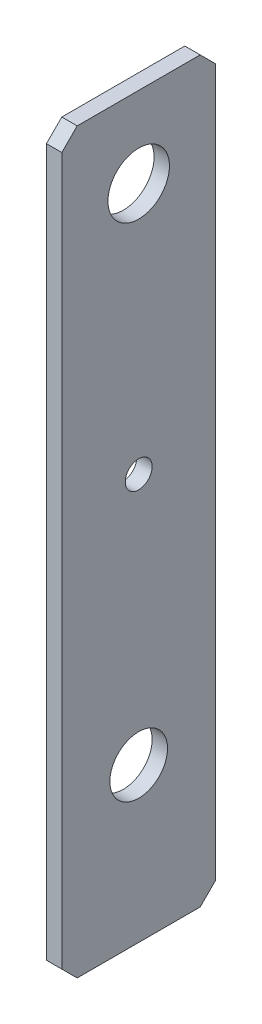
ISO-10303-21;
HEADER;
FILE_DESCRIPTION(('STEP AP214'),'2;1');
FILE_NAME('part.step','',(''),(''),'','','');
FILE_SCHEMA(('AUTOMOTIVE_DESIGN { 1 0 10303 214 1 1 1 1 }'));
ENDSEC;
DATA;
#1=APPLICATION_CONTEXT('core data for automotive mechanical design processes');
#2=APPLICATION_PROTOCOL_DEFINITION('international standard','automotive_design',2000,#1);
#3=PRODUCT_CONTEXT('',#1,'mechanical');
#4=PRODUCT('Part','Part','',(#3));
#5=PRODUCT_RELATED_PRODUCT_CATEGORY('part','',(#4));
#6=PRODUCT_DEFINITION_FORMATION('','',#4);
#7=PRODUCT_DEFINITION_CONTEXT('part definition',#1,'design');
#8=PRODUCT_DEFINITION('design','',#6,#7);
#9=PRODUCT_DEFINITION_SHAPE('','',#8);
#10=(LENGTH_UNIT() NAMED_UNIT(*) SI_UNIT(.MILLI.,.METRE.));
#11=(NAMED_UNIT(*) PLANE_ANGLE_UNIT() SI_UNIT($,.RADIAN.));
#12=(NAMED_UNIT(*) SI_UNIT($,.STERADIAN.) SOLID_ANGLE_UNIT());
#13=UNCERTAINTY_MEASURE_WITH_UNIT(LENGTH_MEASURE(1.E-05),#10,'distance_accuracy_value','');
#14=(GEOMETRIC_REPRESENTATION_CONTEXT(3) GLOBAL_UNCERTAINTY_ASSIGNED_CONTEXT((#13)) GLOBAL_UNIT_ASSIGNED_CONTEXT((#10,
#11,#12)) REPRESENTATION_CONTEXT('',''));
#15=CARTESIAN_POINT('',(0.,0.,0.));
#16=DIRECTION('',(0.,0.,1.));
#17=DIRECTION('',(1.,0.,0.));
#18=AXIS2_PLACEMENT_3D('',#15,#16,#17);
#19=CARTESIAN_POINT('',(2.,0.,0.));
#20=DIRECTION('',(0.,0.,-1.));
#21=DIRECTION('',(-1.,0.,0.));
#22=AXIS2_PLACEMENT_3D('',#19,#20,#21);
#23=PLANE('',#22);
#24=DIRECTION('',(0.,-1.,0.));
#25=VECTOR('',#24,1.);
#26=CARTESIAN_POINT('',(0.,0.,0.));
#27=LINE('',#26,#25);
#28=CARTESIAN_POINT('',(0.,94.,0.));
#29=VERTEX_POINT('',#28);
#30=CARTESIAN_POINT('',(0.,2.00000000000003,0.));
#31=VERTEX_POINT('',#30);
#32=EDGE_CURVE('E133',#29,#31,#27,.T.);
#33=ORIENTED_EDGE('',*,*,#32,.T.);
#34=DIRECTION('',(1.,0.,0.));
#35=VECTOR('',#34,1.);
#36=CARTESIAN_POINT('',(2.,2.00000000000003,0.));
#37=LINE('',#36,#35);
#38=CARTESIAN_POINT('',(2.,2.00000000000003,0.));
#39=VERTEX_POINT('',#38);
#40=EDGE_CURVE('E155',#31,#39,#37,.T.);
#41=ORIENTED_EDGE('',*,*,#40,.T.);
#42=DIRECTION('',(0.,-1.,0.));
#43=VECTOR('',#42,1.);
#44=CARTESIAN_POINT('',(2.,0.,0.));
#45=LINE('',#44,#43);
#46=CARTESIAN_POINT('',(2.,94.,0.));
#47=VERTEX_POINT('',#46);
#48=EDGE_CURVE('E131',#47,#39,#45,.T.);
#49=ORIENTED_EDGE('',*,*,#48,.F.);
#50=DIRECTION('',(-1.,0.,0.));
#51=VECTOR('',#50,1.);
#52=CARTESIAN_POINT('',(2.,94.,0.));
#53=LINE('',#52,#51);
#54=EDGE_CURVE('E152',#47,#29,#53,.T.);
#55=ORIENTED_EDGE('',*,*,#54,.T.);
#56=EDGE_LOOP('',(#33,#41,#49,#55));
#57=FACE_BOUND('',#56,.T.);
#58=ADVANCED_FACE('F35',(#57),#23,.F.);
#59=CARTESIAN_POINT('',(2.,0.,0.));
#60=DIRECTION('',(0.,1.,0.));
#61=DIRECTION('',(0.,0.,1.));
#62=AXIS2_PLACEMENT_3D('',#59,#60,#61);
#63=PLANE('',#62);
#64=DIRECTION('',(0.,0.,-1.));
#65=VECTOR('',#64,1.);
#66=CARTESIAN_POINT('',(0.,0.,0.));
#67=LINE('',#66,#65);
#68=CARTESIAN_POINT('',(0.,0.,-2.00000000000002));
#69=VERTEX_POINT('',#68);
#70=CARTESIAN_POINT('',(0.,0.,-18.));
#71=VERTEX_POINT('',#70);
#72=EDGE_CURVE('E129',#69,#71,#67,.T.);
#73=ORIENTED_EDGE('',*,*,#72,.T.);
#74=DIRECTION('',(1.,0.,0.));
#75=VECTOR('',#74,1.);
#76=CARTESIAN_POINT('',(2.,0.,-18.));
#77=LINE('',#76,#75);
#78=CARTESIAN_POINT('',(2.,0.,-18.));
#79=VERTEX_POINT('',#78);
#80=EDGE_CURVE('E107',#71,#79,#77,.T.);
#81=ORIENTED_EDGE('',*,*,#80,.T.);
#82=DIRECTION('',(0.,0.,-1.));
#83=VECTOR('',#82,1.);
#84=CARTESIAN_POINT('',(2.,0.,0.));
#85=LINE('',#84,#83);
#86=CARTESIAN_POINT('',(2.,0.,-2.00000000000002));
#87=VERTEX_POINT('',#86);
#88=EDGE_CURVE('E169',#87,#79,#85,.T.);
#89=ORIENTED_EDGE('',*,*,#88,.F.);
#90=DIRECTION('',(-1.,0.,0.));
#91=VECTOR('',#90,1.);
#92=CARTESIAN_POINT('',(2.,0.,-2.00000000000002));
#93=LINE('',#92,#91);
#94=EDGE_CURVE('E112',#87,#69,#93,.T.);
#95=ORIENTED_EDGE('',*,*,#94,.T.);
#96=EDGE_LOOP('',(#73,#81,#89,#95));
#97=FACE_BOUND('',#96,.T.);
#98=ADVANCED_FACE('F174',(#97),#63,.F.);
#99=CARTESIAN_POINT('',(2.,0.,-20.));
#100=DIRECTION('',(0.,0.,1.));
#101=DIRECTION('',(1.,0.,0.));
#102=AXIS2_PLACEMENT_3D('',#99,#100,#101);
#103=PLANE('',#102);
#104=DIRECTION('',(0.,1.,0.));
#105=VECTOR('',#104,1.);
#106=CARTESIAN_POINT('',(2.,0.,-20.));
#107=LINE('',#106,#105);
#108=CARTESIAN_POINT('',(2.,2.00000000000002,-20.));
#109=VERTEX_POINT('',#108);
#110=CARTESIAN_POINT('',(2.,94.,-20.));
#111=VERTEX_POINT('',#110);
#112=EDGE_CURVE('E121',#109,#111,#107,.T.);
#113=ORIENTED_EDGE('',*,*,#112,.F.);
#114=DIRECTION('',(-1.,0.,0.));
#115=VECTOR('',#114,1.);
#116=CARTESIAN_POINT('',(2.,2.00000000000002,-20.));
#117=LINE('',#116,#115);
#118=CARTESIAN_POINT('',(0.,2.00000000000002,-20.));
#119=VERTEX_POINT('',#118);
#120=EDGE_CURVE('E106',#109,#119,#117,.T.);
#121=ORIENTED_EDGE('',*,*,#120,.T.);
#122=DIRECTION('',(0.,1.,0.));
#123=VECTOR('',#122,1.);
#124=CARTESIAN_POINT('',(0.,0.,-20.));
#125=LINE('',#124,#123);
#126=CARTESIAN_POINT('',(0.,94.,-20.));
#127=VERTEX_POINT('',#126);
#128=EDGE_CURVE('E119',#119,#127,#125,.T.);
#129=ORIENTED_EDGE('',*,*,#128,.T.);
#130=DIRECTION('',(1.,0.,0.));
#131=VECTOR('',#130,1.);
#132=CARTESIAN_POINT('',(2.,94.,-20.));
#133=LINE('',#132,#131);
#134=EDGE_CURVE('E123',#127,#111,#133,.T.);
#135=ORIENTED_EDGE('',*,*,#134,.T.);
#136=EDGE_LOOP('',(#113,#121,#129,#135));
#137=FACE_BOUND('',#136,.T.);
#138=ADVANCED_FACE('F118',(#137),#103,.F.);
#139=CARTESIAN_POINT('',(2.,96.,0.));
#140=DIRECTION('',(0.,-1.,0.));
#141=DIRECTION('',(0.,0.,-1.));
#142=AXIS2_PLACEMENT_3D('',#139,#140,#141);
#143=PLANE('',#142);
#144=DIRECTION('',(0.,0.,1.));
#145=VECTOR('',#144,1.);
#146=CARTESIAN_POINT('',(2.,96.,0.));
#147=LINE('',#146,#145);
#148=CARTESIAN_POINT('',(2.,96.,-18.));
#149=VERTEX_POINT('',#148);
#150=CARTESIAN_POINT('',(2.,96.,-2.00000000000002));
#151=VERTEX_POINT('',#150);
#152=EDGE_CURVE('E137',#149,#151,#147,.T.);
#153=ORIENTED_EDGE('',*,*,#152,.F.);
#154=DIRECTION('',(-1.,0.,0.));
#155=VECTOR('',#154,1.);
#156=CARTESIAN_POINT('',(2.,96.,-18.));
#157=LINE('',#156,#155);
#158=CARTESIAN_POINT('',(0.,96.,-18.));
#159=VERTEX_POINT('',#158);
#160=EDGE_CURVE('E11',#149,#159,#157,.T.);
#161=ORIENTED_EDGE('',*,*,#160,.T.);
#162=DIRECTION('',(0.,0.,1.));
#163=VECTOR('',#162,1.);
#164=CARTESIAN_POINT('',(0.,96.,0.));
#165=LINE('',#164,#163);
#166=CARTESIAN_POINT('',(0.,96.,-2.00000000000002));
#167=VERTEX_POINT('',#166);
#168=EDGE_CURVE('E128',#159,#167,#165,.T.);
#169=ORIENTED_EDGE('',*,*,#168,.T.);
#170=DIRECTION('',(1.,0.,0.));
#171=VECTOR('',#170,1.);
#172=CARTESIAN_POINT('',(2.,96.,-2.00000000000002));
#173=LINE('',#172,#171);
#174=EDGE_CURVE('E44',#167,#151,#173,.T.);
#175=ORIENTED_EDGE('',*,*,#174,.T.);
#176=EDGE_LOOP('',(#153,#161,#169,#175));
#177=FACE_BOUND('',#176,.T.);
#178=ADVANCED_FACE('F202',(#177),#143,.F.);
#179=CARTESIAN_POINT('',(2.,0.,0.));
#180=DIRECTION('',(-1.,0.,0.));
#181=DIRECTION('',(0.,0.,1.));
#182=AXIS2_PLACEMENT_3D('',#179,#180,#181);
#183=PLANE('',#182);
#184=CARTESIAN_POINT('',(2.,85.5,-10.));
#185=DIRECTION('',(1.,0.,0.));
#186=DIRECTION('',(0.,0.,-1.));
#187=AXIS2_PLACEMENT_3D('',#184,#185,#186);
#188=CIRCLE('',#187,4.);
#189=CARTESIAN_POINT('',(2.,85.5,-14.));
#190=VERTEX_POINT('',#189);
#191=EDGE_CURVE('E177',#190,#190,#188,.T.);
#192=ORIENTED_EDGE('',*,*,#191,.F.);
#193=EDGE_LOOP('',(#192));
#194=FACE_BOUND('',#193,.T.);
#195=CARTESIAN_POINT('',(2.,52.75,-10.));
#196=DIRECTION('',(1.,0.,0.));
#197=DIRECTION('',(0.,0.,-1.));
#198=AXIS2_PLACEMENT_3D('',#195,#196,#197);
#199=CIRCLE('',#198,1.75);
#200=CARTESIAN_POINT('',(2.,52.75,-11.75));
#201=VERTEX_POINT('',#200);
#202=EDGE_CURVE('E189',#201,#201,#199,.T.);
#203=ORIENTED_EDGE('',*,*,#202,.F.);
#204=EDGE_LOOP('',(#203));
#205=FACE_BOUND('',#204,.T.);
#206=CARTESIAN_POINT('',(2.,20.,-10.));
#207=DIRECTION('',(1.,0.,0.));
#208=DIRECTION('',(0.,0.,-1.));
#209=AXIS2_PLACEMENT_3D('',#206,#207,#208);
#210=CIRCLE('',#209,3.75);
#211=CARTESIAN_POINT('',(2.,20.,-13.75));
#212=VERTEX_POINT('',#211);
#213=EDGE_CURVE('E183',#212,#212,#210,.T.);
#214=ORIENTED_EDGE('',*,*,#213,.F.);
#215=EDGE_LOOP('',(#214));
#216=FACE_BOUND('',#215,.T.);
#217=ORIENTED_EDGE('',*,*,#88,.T.);
#218=DIRECTION('',(0.,-0.707106781186545,0.70710678118655));
#219=VECTOR('',#218,1.);
#220=CARTESIAN_POINT('',(2.,2.00000000000002,-20.));
#221=LINE('',#220,#219);
#222=EDGE_CURVE('E150',#79,#109,#221,.F.);
#223=ORIENTED_EDGE('',*,*,#222,.T.);
#224=ORIENTED_EDGE('',*,*,#112,.T.);
#225=DIRECTION('',(0.,-0.70710678118655,-0.707106781186545));
#226=VECTOR('',#225,1.);
#227=CARTESIAN_POINT('',(2.,96.,-18.));
#228=LINE('',#227,#226);
#229=EDGE_CURVE('E57',#111,#149,#228,.F.);
#230=ORIENTED_EDGE('',*,*,#229,.T.);
#231=ORIENTED_EDGE('',*,*,#152,.T.);
#232=DIRECTION('',(0.,0.707106781186545,-0.70710678118655));
#233=VECTOR('',#232,1.);
#234=CARTESIAN_POINT('',(2.,94.,0.));
#235=LINE('',#234,#233);
#236=EDGE_CURVE('E145',#151,#47,#235,.F.);
#237=ORIENTED_EDGE('',*,*,#236,.T.);
#238=ORIENTED_EDGE('',*,*,#48,.T.);
#239=DIRECTION('',(0.,0.70710678118655,0.707106781186545));
#240=VECTOR('',#239,1.);
#241=CARTESIAN_POINT('',(2.,0.,-2.00000000000002));
#242=LINE('',#241,#240);
#243=EDGE_CURVE('E148',#39,#87,#242,.F.);
#244=ORIENTED_EDGE('',*,*,#243,.T.);
#245=EDGE_LOOP('',(#217,#223,#224,#230,#231,#237,#238,#244));
#246=FACE_BOUND('',#245,.T.);
#247=ADVANCED_FACE('F166',(#194,#205,#216,#246),#183,.F.);
#248=CARTESIAN_POINT('',(0.,0.,0.));
#249=DIRECTION('',(-1.,0.,0.));
#250=DIRECTION('',(0.,0.,1.));
#251=AXIS2_PLACEMENT_3D('',#248,#249,#250);
#252=PLANE('',#251);
#253=CARTESIAN_POINT('',(0.,85.5,-10.));
#254=DIRECTION('',(1.,0.,0.));
#255=DIRECTION('',(0.,0.,-1.));
#256=AXIS2_PLACEMENT_3D('',#253,#254,#255);
#257=CIRCLE('',#256,4.);
#258=CARTESIAN_POINT('',(0.,85.5,-14.));
#259=VERTEX_POINT('',#258);
#260=EDGE_CURVE('E175',#259,#259,#257,.T.);
#261=ORIENTED_EDGE('',*,*,#260,.T.);
#262=EDGE_LOOP('',(#261));
#263=FACE_BOUND('',#262,.T.);
#264=CARTESIAN_POINT('',(0.,52.75,-10.));
#265=DIRECTION('',(1.,0.,0.));
#266=DIRECTION('',(0.,0.,-1.));
#267=AXIS2_PLACEMENT_3D('',#264,#265,#266);
#268=CIRCLE('',#267,1.75);
#269=CARTESIAN_POINT('',(0.,52.75,-11.75));
#270=VERTEX_POINT('',#269);
#271=EDGE_CURVE('E192',#270,#270,#268,.T.);
#272=ORIENTED_EDGE('',*,*,#271,.T.);
#273=EDGE_LOOP('',(#272));
#274=FACE_BOUND('',#273,.T.);
#275=CARTESIAN_POINT('',(0.,20.,-10.));
#276=DIRECTION('',(1.,0.,0.));
#277=DIRECTION('',(0.,0.,-1.));
#278=AXIS2_PLACEMENT_3D('',#275,#276,#277);
#279=CIRCLE('',#278,3.75);
#280=CARTESIAN_POINT('',(0.,20.,-13.75));
#281=VERTEX_POINT('',#280);
#282=EDGE_CURVE('E186',#281,#281,#279,.T.);
#283=ORIENTED_EDGE('',*,*,#282,.T.);
#284=EDGE_LOOP('',(#283));
#285=FACE_BOUND('',#284,.T.);
#286=ORIENTED_EDGE('',*,*,#128,.F.);
#287=DIRECTION('',(0.,0.707106781186545,-0.70710678118655));
#288=VECTOR('',#287,1.);
#289=CARTESIAN_POINT('',(0.,-8.99999999999999,-8.99999999999993));
#290=LINE('',#289,#288);
#291=EDGE_CURVE('E102',#119,#71,#290,.F.);
#292=ORIENTED_EDGE('',*,*,#291,.T.);
#293=ORIENTED_EDGE('',*,*,#72,.F.);
#294=DIRECTION('',(0.,-0.70710678118655,-0.707106781186545));
#295=VECTOR('',#294,1.);
#296=CARTESIAN_POINT('',(0.,1.00000000000001,-1.00000000000001));
#297=LINE('',#296,#295);
#298=EDGE_CURVE('E113',#69,#31,#297,.F.);
#299=ORIENTED_EDGE('',*,*,#298,.T.);
#300=ORIENTED_EDGE('',*,*,#32,.F.);
#301=DIRECTION('',(0.,-0.707106781186545,0.70710678118655));
#302=VECTOR('',#301,1.);
#303=CARTESIAN_POINT('',(0.,47.0000000000003,47.));
#304=LINE('',#303,#302);
#305=EDGE_CURVE('E122',#29,#167,#304,.F.);
#306=ORIENTED_EDGE('',*,*,#305,.T.);
#307=ORIENTED_EDGE('',*,*,#168,.F.);
#308=DIRECTION('',(0.,0.70710678118655,0.707106781186545));
#309=VECTOR('',#308,1.);
#310=CARTESIAN_POINT('',(0.,56.9999999999997,-57.0000000000001));
#311=LINE('',#310,#309);
#312=EDGE_CURVE('E127',#159,#127,#311,.F.);
#313=ORIENTED_EDGE('',*,*,#312,.T.);
#314=EDGE_LOOP('',(#286,#292,#293,#299,#300,#306,#307,#313));
#315=FACE_BOUND('',#314,.T.);
#316=ADVANCED_FACE('F125',(#263,#274,#285,#315),#252,.T.);
#317=CARTESIAN_POINT('',(0.,20.,-10.));
#318=DIRECTION('',(1.,0.,0.));
#319=DIRECTION('',(0.,0.,-1.));
#320=AXIS2_PLACEMENT_3D('',#317,#318,#319);
#321=CYLINDRICAL_SURFACE('',#320,3.75);
#322=ORIENTED_EDGE('',*,*,#282,.F.);
#323=EDGE_LOOP('',(#322));
#324=FACE_BOUND('',#323,.T.);
#325=ORIENTED_EDGE('',*,*,#213,.T.);
#326=EDGE_LOOP('',(#325));
#327=FACE_BOUND('',#326,.T.);
#328=ADVANCED_FACE('F208',(#324,#327),#321,.F.);
#329=CARTESIAN_POINT('',(0.,52.75,-10.));
#330=DIRECTION('',(1.,0.,0.));
#331=DIRECTION('',(0.,0.,-1.));
#332=AXIS2_PLACEMENT_3D('',#329,#330,#331);
#333=CYLINDRICAL_SURFACE('',#332,1.75);
#334=ORIENTED_EDGE('',*,*,#271,.F.);
#335=EDGE_LOOP('',(#334));
#336=FACE_BOUND('',#335,.T.);
#337=ORIENTED_EDGE('',*,*,#202,.T.);
#338=EDGE_LOOP('',(#337));
#339=FACE_BOUND('',#338,.T.);
#340=ADVANCED_FACE('F210',(#336,#339),#333,.F.);
#341=CARTESIAN_POINT('',(0.,85.5,-10.));
#342=DIRECTION('',(1.,0.,0.));
#343=DIRECTION('',(0.,0.,-1.));
#344=AXIS2_PLACEMENT_3D('',#341,#342,#343);
#345=CYLINDRICAL_SURFACE('',#344,4.);
#346=ORIENTED_EDGE('',*,*,#260,.F.);
#347=EDGE_LOOP('',(#346));
#348=FACE_BOUND('',#347,.T.);
#349=ORIENTED_EDGE('',*,*,#191,.T.);
#350=EDGE_LOOP('',(#349));
#351=FACE_BOUND('',#350,.T.);
#352=ADVANCED_FACE('F198',(#348,#351),#345,.F.);
#353=CARTESIAN_POINT('',(2.,2.00000000000002,-20.));
#354=DIRECTION('',(0.,0.70710678118655,0.707106781186545));
#355=DIRECTION('',(-1.,0.,0.));
#356=AXIS2_PLACEMENT_3D('',#353,#354,#355);
#357=PLANE('',#356);
#358=ORIENTED_EDGE('',*,*,#222,.F.);
#359=ORIENTED_EDGE('',*,*,#80,.F.);
#360=ORIENTED_EDGE('',*,*,#291,.F.);
#361=ORIENTED_EDGE('',*,*,#120,.F.);
#362=EDGE_LOOP('',(#358,#359,#360,#361));
#363=FACE_BOUND('',#362,.T.);
#364=ADVANCED_FACE('F105',(#363),#357,.F.);
#365=CARTESIAN_POINT('',(2.,0.,-2.00000000000002));
#366=DIRECTION('',(0.,0.707106781186545,-0.70710678118655));
#367=DIRECTION('',(-1.,0.,0.));
#368=AXIS2_PLACEMENT_3D('',#365,#366,#367);
#369=PLANE('',#368);
#370=ORIENTED_EDGE('',*,*,#243,.F.);
#371=ORIENTED_EDGE('',*,*,#40,.F.);
#372=ORIENTED_EDGE('',*,*,#298,.F.);
#373=ORIENTED_EDGE('',*,*,#94,.F.);
#374=EDGE_LOOP('',(#370,#371,#372,#373));
#375=FACE_BOUND('',#374,.T.);
#376=ADVANCED_FACE('F172',(#375),#369,.F.);
#377=CARTESIAN_POINT('',(2.,96.,-18.));
#378=DIRECTION('',(0.,-0.707106781186545,0.70710678118655));
#379=DIRECTION('',(-1.,0.,0.));
#380=AXIS2_PLACEMENT_3D('',#377,#378,#379);
#381=PLANE('',#380);
#382=ORIENTED_EDGE('',*,*,#229,.F.);
#383=ORIENTED_EDGE('',*,*,#134,.F.);
#384=ORIENTED_EDGE('',*,*,#312,.F.);
#385=ORIENTED_EDGE('',*,*,#160,.F.);
#386=EDGE_LOOP('',(#382,#383,#384,#385));
#387=FACE_BOUND('',#386,.T.);
#388=ADVANCED_FACE('F240',(#387),#381,.F.);
#389=CARTESIAN_POINT('',(2.,94.,0.));
#390=DIRECTION('',(0.,-0.70710678118655,-0.707106781186545));
#391=DIRECTION('',(-1.,0.,0.));
#392=AXIS2_PLACEMENT_3D('',#389,#390,#391);
#393=PLANE('',#392);
#394=ORIENTED_EDGE('',*,*,#236,.F.);
#395=ORIENTED_EDGE('',*,*,#174,.F.);
#396=ORIENTED_EDGE('',*,*,#305,.F.);
#397=ORIENTED_EDGE('',*,*,#54,.F.);
#398=EDGE_LOOP('',(#394,#395,#396,#397));
#399=FACE_BOUND('',#398,.T.);
#400=ADVANCED_FACE('F38',(#399),#393,.F.);
#401=CLOSED_SHELL('',(#58,#98,#138,#178,#247,#316,#328,#340,#352,#364,#376,#388,#400));
#402=MANIFOLD_SOLID_BREP('B2',#401);
#403=ADVANCED_BREP_SHAPE_REPRESENTATION('',(#18,#402),#14);
#404=SHAPE_DEFINITION_REPRESENTATION(#9,#403);
ENDSEC;
END-ISO-10303-21;
